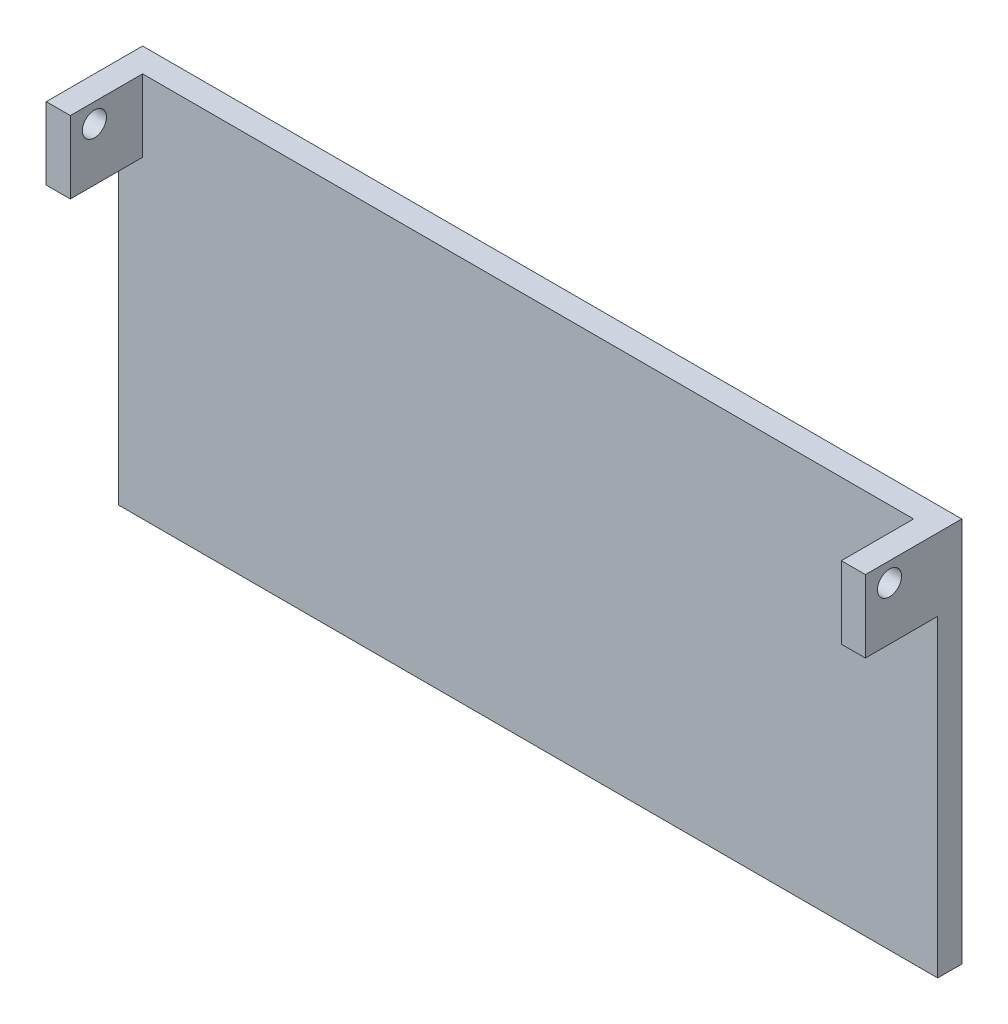
ISO-10303-21;
HEADER;
FILE_DESCRIPTION(('STEP AP214'),'2;1');
FILE_NAME('part.step','',(''),(''),'','','');
FILE_SCHEMA(('AUTOMOTIVE_DESIGN { 1 0 10303 214 1 1 1 1 }'));
ENDSEC;
DATA;
#1=APPLICATION_CONTEXT('core data for automotive mechanical design processes');
#2=APPLICATION_PROTOCOL_DEFINITION('international standard','automotive_design',2000,#1);
#3=PRODUCT_CONTEXT('',#1,'mechanical');
#4=PRODUCT('Part','Part','',(#3));
#5=PRODUCT_RELATED_PRODUCT_CATEGORY('part','',(#4));
#6=PRODUCT_DEFINITION_FORMATION('','',#4);
#7=PRODUCT_DEFINITION_CONTEXT('part definition',#1,'design');
#8=PRODUCT_DEFINITION('design','',#6,#7);
#9=PRODUCT_DEFINITION_SHAPE('','',#8);
#10=(LENGTH_UNIT() NAMED_UNIT(*) SI_UNIT(.MILLI.,.METRE.));
#11=(NAMED_UNIT(*) PLANE_ANGLE_UNIT() SI_UNIT($,.RADIAN.));
#12=(NAMED_UNIT(*) SI_UNIT($,.STERADIAN.) SOLID_ANGLE_UNIT());
#13=UNCERTAINTY_MEASURE_WITH_UNIT(LENGTH_MEASURE(1.E-05),#10,'distance_accuracy_value','');
#14=(GEOMETRIC_REPRESENTATION_CONTEXT(3) GLOBAL_UNCERTAINTY_ASSIGNED_CONTEXT((#13)) GLOBAL_UNIT_ASSIGNED_CONTEXT((#10,
#11,#12)) REPRESENTATION_CONTEXT('',''));
#15=CARTESIAN_POINT('',(0.,0.,0.));
#16=DIRECTION('',(0.,0.,1.));
#17=DIRECTION('',(1.,0.,0.));
#18=AXIS2_PLACEMENT_3D('',#15,#16,#17);
#19=CARTESIAN_POINT('',(-87.9437229437229,0.,5.));
#20=DIRECTION('',(1.,0.,0.));
#21=DIRECTION('',(0.,0.,-1.));
#22=AXIS2_PLACEMENT_3D('',#19,#20,#21);
#23=PLANE('',#22);
#24=DIRECTION('',(0.,-1.,0.));
#25=VECTOR('',#24,1.);
#26=CARTESIAN_POINT('',(-87.9437229437229,0.,5.));
#27=LINE('',#26,#25);
#28=CARTESIAN_POINT('',(-87.9437229437229,-15.,5.));
#29=VERTEX_POINT('',#28);
#30=CARTESIAN_POINT('',(-87.9437229437229,-80.,5.));
#31=VERTEX_POINT('',#30);
#32=EDGE_CURVE('E200',#29,#31,#27,.T.);
#33=ORIENTED_EDGE('',*,*,#32,.F.);
#34=DIRECTION('',(0.,0.,1.));
#35=VECTOR('',#34,1.);
#36=CARTESIAN_POINT('',(-87.9437229437229,-15.,0.));
#37=LINE('',#36,#35);
#38=CARTESIAN_POINT('',(-87.9437229437229,-15.,20.));
#39=VERTEX_POINT('',#38);
#40=EDGE_CURVE('E163',#29,#39,#37,.T.);
#41=ORIENTED_EDGE('',*,*,#40,.T.);
#42=DIRECTION('',(0.,1.,0.));
#43=VECTOR('',#42,1.);
#44=CARTESIAN_POINT('',(-87.9437229437229,0.,20.));
#45=LINE('',#44,#43);
#46=CARTESIAN_POINT('',(-87.9437229437229,0.,20.));
#47=VERTEX_POINT('',#46);
#48=EDGE_CURVE('E171',#39,#47,#45,.T.);
#49=ORIENTED_EDGE('',*,*,#48,.T.);
#50=DIRECTION('',(0.,0.,-1.));
#51=VECTOR('',#50,1.);
#52=CARTESIAN_POINT('',(-87.9437229437229,0.,5.));
#53=LINE('',#52,#51);
#54=CARTESIAN_POINT('',(-87.9437229437229,0.,0.));
#55=VERTEX_POINT('',#54);
#56=EDGE_CURVE('E212',#47,#55,#53,.T.);
#57=ORIENTED_EDGE('',*,*,#56,.T.);
#58=DIRECTION('',(0.,-1.,0.));
#59=VECTOR('',#58,1.);
#60=CARTESIAN_POINT('',(-87.9437229437229,0.,0.));
#61=LINE('',#60,#59);
#62=CARTESIAN_POINT('',(-87.9437229437229,-80.,0.));
#63=VERTEX_POINT('',#62);
#64=EDGE_CURVE('E199',#55,#63,#61,.T.);
#65=ORIENTED_EDGE('',*,*,#64,.T.);
#66=DIRECTION('',(0.,0.,-1.));
#67=VECTOR('',#66,1.);
#68=CARTESIAN_POINT('',(-87.9437229437229,-80.,5.));
#69=LINE('',#68,#67);
#70=EDGE_CURVE('E11',#31,#63,#69,.T.);
#71=ORIENTED_EDGE('',*,*,#70,.F.);
#72=EDGE_LOOP('',(#33,#41,#49,#57,#65,#71));
#73=FACE_BOUND('',#72,.T.);
#74=CARTESIAN_POINT('',(-87.9437229437229,-4.,15.));
#75=DIRECTION('',(-1.,0.,0.));
#76=DIRECTION('',(0.,0.,1.));
#77=AXIS2_PLACEMENT_3D('',#74,#75,#76);
#78=CIRCLE('',#77,2.5);
#79=CARTESIAN_POINT('',(-87.9437229437229,-4.,17.5));
#80=VERTEX_POINT('',#79);
#81=EDGE_CURVE('E158',#80,#80,#78,.T.);
#82=ORIENTED_EDGE('',*,*,#81,.F.);
#83=EDGE_LOOP('',(#82));
#84=FACE_BOUND('',#83,.T.);
#85=ADVANCED_FACE('F39',(#73,#84),#23,.F.);
#86=CARTESIAN_POINT('',(82.0562770562771,-80.,5.));
#87=DIRECTION('',(0.,1.,0.));
#88=DIRECTION('',(-1.,0.,0.));
#89=AXIS2_PLACEMENT_3D('',#86,#87,#88);
#90=PLANE('',#89);
#91=DIRECTION('',(1.,0.,0.));
#92=VECTOR('',#91,1.);
#93=CARTESIAN_POINT('',(82.0562770562771,-80.,0.));
#94=LINE('',#93,#92);
#95=CARTESIAN_POINT('',(82.0562770562771,-80.,0.));
#96=VERTEX_POINT('',#95);
#97=EDGE_CURVE('E215',#63,#96,#94,.T.);
#98=ORIENTED_EDGE('',*,*,#97,.T.);
#99=DIRECTION('',(0.,0.,-1.));
#100=VECTOR('',#99,1.);
#101=CARTESIAN_POINT('',(82.0562770562771,-80.,5.));
#102=LINE('',#101,#100);
#103=CARTESIAN_POINT('',(82.0562770562771,-80.,5.));
#104=VERTEX_POINT('',#103);
#105=EDGE_CURVE('E47',#104,#96,#102,.T.);
#106=ORIENTED_EDGE('',*,*,#105,.F.);
#107=DIRECTION('',(1.,0.,0.));
#108=VECTOR('',#107,1.);
#109=CARTESIAN_POINT('',(82.0562770562771,-80.,5.));
#110=LINE('',#109,#108);
#111=EDGE_CURVE('E203',#31,#104,#110,.T.);
#112=ORIENTED_EDGE('',*,*,#111,.F.);
#113=ORIENTED_EDGE('',*,*,#70,.T.);
#114=EDGE_LOOP('',(#98,#106,#112,#113));
#115=FACE_BOUND('',#114,.T.);
#116=ADVANCED_FACE('F272',(#115),#90,.F.);
#117=CARTESIAN_POINT('',(82.0562770562771,0.,5.));
#118=DIRECTION('',(-1.,0.,0.));
#119=DIRECTION('',(0.,-1.,0.));
#120=AXIS2_PLACEMENT_3D('',#117,#118,#119);
#121=PLANE('',#120);
#122=DIRECTION('',(0.,1.,0.));
#123=VECTOR('',#122,1.);
#124=CARTESIAN_POINT('',(82.0562770562771,0.,0.));
#125=LINE('',#124,#123);
#126=CARTESIAN_POINT('',(82.0562770562771,0.,0.));
#127=VERTEX_POINT('',#126);
#128=EDGE_CURVE('E218',#96,#127,#125,.T.);
#129=ORIENTED_EDGE('',*,*,#128,.T.);
#130=DIRECTION('',(0.,0.,-1.));
#131=VECTOR('',#130,1.);
#132=CARTESIAN_POINT('',(82.0562770562771,0.,5.));
#133=LINE('',#132,#131);
#134=CARTESIAN_POINT('',(82.0562770562771,0.,20.));
#135=VERTEX_POINT('',#134);
#136=EDGE_CURVE('E226',#135,#127,#133,.T.);
#137=ORIENTED_EDGE('',*,*,#136,.F.);
#138=DIRECTION('',(0.,-1.,0.));
#139=VECTOR('',#138,1.);
#140=CARTESIAN_POINT('',(82.0562770562771,0.,20.));
#141=LINE('',#140,#139);
#142=CARTESIAN_POINT('',(82.0562770562771,-14.9999999999999,20.));
#143=VERTEX_POINT('',#142);
#144=EDGE_CURVE('E133',#135,#143,#141,.T.);
#145=ORIENTED_EDGE('',*,*,#144,.T.);
#146=DIRECTION('',(0.,0.,-1.));
#147=VECTOR('',#146,1.);
#148=CARTESIAN_POINT('',(82.0562770562771,-14.9999999999999,20.));
#149=LINE('',#148,#147);
#150=CARTESIAN_POINT('',(82.0562770562771,-14.9999999999999,5.));
#151=VERTEX_POINT('',#150);
#152=EDGE_CURVE('E126',#143,#151,#149,.T.);
#153=ORIENTED_EDGE('',*,*,#152,.T.);
#154=DIRECTION('',(0.,1.,0.));
#155=VECTOR('',#154,1.);
#156=CARTESIAN_POINT('',(82.0562770562771,0.,5.));
#157=LINE('',#156,#155);
#158=EDGE_CURVE('E207',#104,#151,#157,.T.);
#159=ORIENTED_EDGE('',*,*,#158,.F.);
#160=ORIENTED_EDGE('',*,*,#105,.T.);
#161=EDGE_LOOP('',(#129,#137,#145,#153,#159,#160));
#162=FACE_BOUND('',#161,.T.);
#163=CARTESIAN_POINT('',(82.0562770562771,-3.99999999999994,15.));
#164=DIRECTION('',(1.,0.,0.));
#165=DIRECTION('',(0.,1.,0.));
#166=AXIS2_PLACEMENT_3D('',#163,#164,#165);
#167=CIRCLE('',#166,2.5);
#168=CARTESIAN_POINT('',(82.0562770562771,-1.49999999999994,15.));
#169=VERTEX_POINT('',#168);
#170=EDGE_CURVE('E399',#169,#169,#167,.T.);
#171=ORIENTED_EDGE('',*,*,#170,.F.);
#172=EDGE_LOOP('',(#171));
#173=FACE_BOUND('',#172,.T.);
#174=ADVANCED_FACE('F234',(#162,#173),#121,.F.);
#175=CARTESIAN_POINT('',(82.0562770562771,0.,5.));
#176=DIRECTION('',(0.,-1.,0.));
#177=DIRECTION('',(0.,0.,-1.));
#178=AXIS2_PLACEMENT_3D('',#175,#176,#177);
#179=PLANE('',#178);
#180=DIRECTION('',(-1.,0.,0.));
#181=VECTOR('',#180,1.);
#182=CARTESIAN_POINT('',(82.0562770562771,0.,0.));
#183=LINE('',#182,#181);
#184=EDGE_CURVE('E204',#127,#55,#183,.T.);
#185=ORIENTED_EDGE('',*,*,#184,.T.);
#186=ORIENTED_EDGE('',*,*,#56,.F.);
#187=DIRECTION('',(-1.,0.,0.));
#188=VECTOR('',#187,1.);
#189=CARTESIAN_POINT('',(-82.9437229437229,0.,20.));
#190=LINE('',#189,#188);
#191=CARTESIAN_POINT('',(-82.9437229437229,0.,20.));
#192=VERTEX_POINT('',#191);
#193=EDGE_CURVE('E184',#192,#47,#190,.T.);
#194=ORIENTED_EDGE('',*,*,#193,.F.);
#195=DIRECTION('',(0.,0.,-1.));
#196=VECTOR('',#195,1.);
#197=CARTESIAN_POINT('',(-82.9437229437229,0.,0.));
#198=LINE('',#197,#196);
#199=CARTESIAN_POINT('',(-82.9437229437229,0.,5.));
#200=VERTEX_POINT('',#199);
#201=EDGE_CURVE('E175',#192,#200,#198,.T.);
#202=ORIENTED_EDGE('',*,*,#201,.T.);
#203=DIRECTION('',(-1.,0.,0.));
#204=VECTOR('',#203,1.);
#205=CARTESIAN_POINT('',(82.0562770562771,0.,5.));
#206=LINE('',#205,#204);
#207=CARTESIAN_POINT('',(77.056277056277,0.,5.));
#208=VERTEX_POINT('',#207);
#209=EDGE_CURVE('E121',#208,#200,#206,.T.);
#210=ORIENTED_EDGE('',*,*,#209,.F.);
#211=DIRECTION('',(0.,0.,1.));
#212=VECTOR('',#211,1.);
#213=CARTESIAN_POINT('',(77.056277056277,0.,0.));
#214=LINE('',#213,#212);
#215=CARTESIAN_POINT('',(77.056277056277,0.,20.));
#216=VERTEX_POINT('',#215);
#217=EDGE_CURVE('E114',#208,#216,#214,.T.);
#218=ORIENTED_EDGE('',*,*,#217,.T.);
#219=DIRECTION('',(1.,0.,0.));
#220=VECTOR('',#219,1.);
#221=CARTESIAN_POINT('',(77.056277056277,0.,20.));
#222=LINE('',#221,#220);
#223=EDGE_CURVE('E118',#216,#135,#222,.T.);
#224=ORIENTED_EDGE('',*,*,#223,.T.);
#225=ORIENTED_EDGE('',*,*,#136,.T.);
#226=EDGE_LOOP('',(#185,#186,#194,#202,#210,#218,#224,#225));
#227=FACE_BOUND('',#226,.T.);
#228=ADVANCED_FACE('F116',(#227),#179,.F.);
#229=CARTESIAN_POINT('',(0.,0.,5.));
#230=DIRECTION('',(0.,0.,-1.));
#231=DIRECTION('',(-1.,0.,0.));
#232=AXIS2_PLACEMENT_3D('',#229,#230,#231);
#233=PLANE('',#232);
#234=ORIENTED_EDGE('',*,*,#158,.T.);
#235=DIRECTION('',(-1.,0.,0.));
#236=VECTOR('',#235,1.);
#237=CARTESIAN_POINT('',(0.,-15.,5.));
#238=LINE('',#237,#236);
#239=CARTESIAN_POINT('',(77.056277056277,-14.9999999999999,5.));
#240=VERTEX_POINT('',#239);
#241=EDGE_CURVE('E54',#151,#240,#238,.T.);
#242=ORIENTED_EDGE('',*,*,#241,.T.);
#243=DIRECTION('',(0.,-1.,0.));
#244=VECTOR('',#243,1.);
#245=CARTESIAN_POINT('',(77.056277056277,0.,5.));
#246=LINE('',#245,#244);
#247=EDGE_CURVE('E58',#208,#240,#246,.T.);
#248=ORIENTED_EDGE('',*,*,#247,.F.);
#249=ORIENTED_EDGE('',*,*,#209,.T.);
#250=DIRECTION('',(0.,1.,0.));
#251=VECTOR('',#250,1.);
#252=CARTESIAN_POINT('',(-82.9437229437229,0.,5.));
#253=LINE('',#252,#251);
#254=CARTESIAN_POINT('',(-82.9437229437229,-15.,5.));
#255=VERTEX_POINT('',#254);
#256=EDGE_CURVE('E188',#255,#200,#253,.T.);
#257=ORIENTED_EDGE('',*,*,#256,.F.);
#258=DIRECTION('',(-1.,0.,0.));
#259=VECTOR('',#258,1.);
#260=CARTESIAN_POINT('',(0.,-15.,5.));
#261=LINE('',#260,#259);
#262=EDGE_CURVE('E195',#255,#29,#261,.T.);
#263=ORIENTED_EDGE('',*,*,#262,.T.);
#264=ORIENTED_EDGE('',*,*,#32,.T.);
#265=ORIENTED_EDGE('',*,*,#111,.T.);
#266=EDGE_LOOP('',(#234,#242,#248,#249,#257,#263,#264,#265));
#267=FACE_BOUND('',#266,.T.);
#268=ADVANCED_FACE('F257',(#267),#233,.F.);
#269=CARTESIAN_POINT('',(0.,0.,0.));
#270=DIRECTION('',(0.,0.,-1.));
#271=DIRECTION('',(-1.,0.,0.));
#272=AXIS2_PLACEMENT_3D('',#269,#270,#271);
#273=PLANE('',#272);
#274=ORIENTED_EDGE('',*,*,#184,.F.);
#275=ORIENTED_EDGE('',*,*,#128,.F.);
#276=ORIENTED_EDGE('',*,*,#97,.F.);
#277=ORIENTED_EDGE('',*,*,#64,.F.);
#278=EDGE_LOOP('',(#274,#275,#276,#277));
#279=FACE_BOUND('',#278,.T.);
#280=ADVANCED_FACE('F241',(#279),#273,.T.);
#281=CARTESIAN_POINT('',(-82.9437229437229,-15.,0.));
#282=DIRECTION('',(0.,-1.,0.));
#283=DIRECTION('',(0.,0.,-1.));
#284=AXIS2_PLACEMENT_3D('',#281,#282,#283);
#285=PLANE('',#284);
#286=ORIENTED_EDGE('',*,*,#262,.F.);
#287=DIRECTION('',(0.,0.,1.));
#288=VECTOR('',#287,1.);
#289=CARTESIAN_POINT('',(-82.9437229437229,-15.,0.));
#290=LINE('',#289,#288);
#291=CARTESIAN_POINT('',(-82.9437229437229,-15.,20.));
#292=VERTEX_POINT('',#291);
#293=EDGE_CURVE('E167',#255,#292,#290,.T.);
#294=ORIENTED_EDGE('',*,*,#293,.T.);
#295=DIRECTION('',(-1.,0.,0.));
#296=VECTOR('',#295,1.);
#297=CARTESIAN_POINT('',(-82.9437229437229,-15.,20.));
#298=LINE('',#297,#296);
#299=EDGE_CURVE('E178',#292,#39,#298,.T.);
#300=ORIENTED_EDGE('',*,*,#299,.T.);
#301=ORIENTED_EDGE('',*,*,#40,.F.);
#302=EDGE_LOOP('',(#286,#294,#300,#301));
#303=FACE_BOUND('',#302,.T.);
#304=ADVANCED_FACE('F259',(#303),#285,.T.);
#305=CARTESIAN_POINT('',(-82.9437229437229,0.,0.));
#306=DIRECTION('',(-1.,0.,0.));
#307=DIRECTION('',(0.,0.,1.));
#308=AXIS2_PLACEMENT_3D('',#305,#306,#307);
#309=PLANE('',#308);
#310=CARTESIAN_POINT('',(-82.9437229437229,-4.,15.));
#311=DIRECTION('',(-1.,0.,0.));
#312=DIRECTION('',(0.,0.,1.));
#313=AXIS2_PLACEMENT_3D('',#310,#311,#312);
#314=CIRCLE('',#313,2.5);
#315=CARTESIAN_POINT('',(-82.9437229437229,-4.,17.5));
#316=VERTEX_POINT('',#315);
#317=EDGE_CURVE('E159',#316,#316,#314,.T.);
#318=ORIENTED_EDGE('',*,*,#317,.T.);
#319=EDGE_LOOP('',(#318));
#320=FACE_BOUND('',#319,.T.);
#321=ORIENTED_EDGE('',*,*,#293,.F.);
#322=ORIENTED_EDGE('',*,*,#256,.T.);
#323=ORIENTED_EDGE('',*,*,#201,.F.);
#324=DIRECTION('',(0.,1.,0.));
#325=VECTOR('',#324,1.);
#326=CARTESIAN_POINT('',(-82.9437229437229,0.,20.));
#327=LINE('',#326,#325);
#328=EDGE_CURVE('E170',#292,#192,#327,.T.);
#329=ORIENTED_EDGE('',*,*,#328,.F.);
#330=EDGE_LOOP('',(#321,#322,#323,#329));
#331=FACE_BOUND('',#330,.T.);
#332=ADVANCED_FACE('F255',(#320,#331),#309,.F.);
#333=CARTESIAN_POINT('',(-82.9437229437229,0.,20.));
#334=DIRECTION('',(0.,0.,1.));
#335=DIRECTION('',(1.,0.,0.));
#336=AXIS2_PLACEMENT_3D('',#333,#334,#335);
#337=PLANE('',#336);
#338=ORIENTED_EDGE('',*,*,#48,.F.);
#339=ORIENTED_EDGE('',*,*,#299,.F.);
#340=ORIENTED_EDGE('',*,*,#328,.T.);
#341=ORIENTED_EDGE('',*,*,#193,.T.);
#342=EDGE_LOOP('',(#338,#339,#340,#341));
#343=FACE_BOUND('',#342,.T.);
#344=ADVANCED_FACE('F250',(#343),#337,.T.);
#345=CARTESIAN_POINT('',(-82.9437229437229,-4.,15.));
#346=DIRECTION('',(-1.,0.,0.));
#347=DIRECTION('',(0.,0.,1.));
#348=AXIS2_PLACEMENT_3D('',#345,#346,#347);
#349=CYLINDRICAL_SURFACE('',#348,2.5);
#350=ORIENTED_EDGE('',*,*,#317,.F.);
#351=EDGE_LOOP('',(#350));
#352=FACE_BOUND('',#351,.T.);
#353=ORIENTED_EDGE('',*,*,#81,.T.);
#354=EDGE_LOOP('',(#353));
#355=FACE_BOUND('',#354,.T.);
#356=ADVANCED_FACE('F302',(#352,#355),#349,.F.);
#357=CARTESIAN_POINT('',(77.056277056277,-14.9999999999999,20.));
#358=DIRECTION('',(0.,-1.,0.));
#359=DIRECTION('',(1.,0.,0.));
#360=AXIS2_PLACEMENT_3D('',#357,#358,#359);
#361=PLANE('',#360);
#362=ORIENTED_EDGE('',*,*,#241,.F.);
#363=ORIENTED_EDGE('',*,*,#152,.F.);
#364=DIRECTION('',(1.,0.,0.));
#365=VECTOR('',#364,1.);
#366=CARTESIAN_POINT('',(77.056277056277,-14.9999999999999,20.));
#367=LINE('',#366,#365);
#368=CARTESIAN_POINT('',(77.056277056277,-14.9999999999999,20.));
#369=VERTEX_POINT('',#368);
#370=EDGE_CURVE('E135',#369,#143,#367,.T.);
#371=ORIENTED_EDGE('',*,*,#370,.F.);
#372=DIRECTION('',(0.,0.,-1.));
#373=VECTOR('',#372,1.);
#374=CARTESIAN_POINT('',(77.056277056277,-14.9999999999999,20.));
#375=LINE('',#374,#373);
#376=EDGE_CURVE('E136',#369,#240,#375,.T.);
#377=ORIENTED_EDGE('',*,*,#376,.T.);
#378=EDGE_LOOP('',(#362,#363,#371,#377));
#379=FACE_BOUND('',#378,.T.);
#380=ADVANCED_FACE('F297',(#379),#361,.T.);
#381=CARTESIAN_POINT('',(77.056277056277,0.,0.));
#382=DIRECTION('',(1.,0.,0.));
#383=DIRECTION('',(0.,0.,-1.));
#384=AXIS2_PLACEMENT_3D('',#381,#382,#383);
#385=PLANE('',#384);
#386=CARTESIAN_POINT('',(77.056277056277,-3.99999999999994,15.));
#387=DIRECTION('',(1.,0.,0.));
#388=DIRECTION('',(0.,1.,0.));
#389=AXIS2_PLACEMENT_3D('',#386,#387,#388);
#390=CIRCLE('',#389,2.5);
#391=CARTESIAN_POINT('',(77.056277056277,-1.49999999999994,15.));
#392=VERTEX_POINT('',#391);
#393=EDGE_CURVE('E148',#392,#392,#390,.T.);
#394=ORIENTED_EDGE('',*,*,#393,.T.);
#395=EDGE_LOOP('',(#394));
#396=FACE_BOUND('',#395,.T.);
#397=ORIENTED_EDGE('',*,*,#217,.F.);
#398=ORIENTED_EDGE('',*,*,#247,.T.);
#399=ORIENTED_EDGE('',*,*,#376,.F.);
#400=DIRECTION('',(0.,-1.,0.));
#401=VECTOR('',#400,1.);
#402=CARTESIAN_POINT('',(77.056277056277,0.,20.));
#403=LINE('',#402,#401);
#404=EDGE_CURVE('E125',#216,#369,#403,.T.);
#405=ORIENTED_EDGE('',*,*,#404,.F.);
#406=EDGE_LOOP('',(#397,#398,#399,#405));
#407=FACE_BOUND('',#406,.T.);
#408=ADVANCED_FACE('F138',(#396,#407),#385,.F.);
#409=CARTESIAN_POINT('',(77.056277056277,0.,20.));
#410=DIRECTION('',(0.,0.,1.));
#411=DIRECTION('',(1.,0.,0.));
#412=AXIS2_PLACEMENT_3D('',#409,#410,#411);
#413=PLANE('',#412);
#414=ORIENTED_EDGE('',*,*,#144,.F.);
#415=ORIENTED_EDGE('',*,*,#223,.F.);
#416=ORIENTED_EDGE('',*,*,#404,.T.);
#417=ORIENTED_EDGE('',*,*,#370,.T.);
#418=EDGE_LOOP('',(#414,#415,#416,#417));
#419=FACE_BOUND('',#418,.T.);
#420=ADVANCED_FACE('F130',(#419),#413,.T.);
#421=CARTESIAN_POINT('',(77.056277056277,-3.99999999999994,15.));
#422=DIRECTION('',(1.,0.,0.));
#423=DIRECTION('',(0.,1.,0.));
#424=AXIS2_PLACEMENT_3D('',#421,#422,#423);
#425=CYLINDRICAL_SURFACE('',#424,2.5);
#426=ORIENTED_EDGE('',*,*,#393,.F.);
#427=EDGE_LOOP('',(#426));
#428=FACE_BOUND('',#427,.T.);
#429=ORIENTED_EDGE('',*,*,#170,.T.);
#430=EDGE_LOOP('',(#429));
#431=FACE_BOUND('',#430,.T.);
#432=ADVANCED_FACE('F323',(#428,#431),#425,.F.);
#433=CLOSED_SHELL('',(#85,#116,#174,#228,#268,#280,#304,#332,#344,#356,#380,#408,#420,#432));
#434=MANIFOLD_SOLID_BREP('B2',#433);
#435=ADVANCED_BREP_SHAPE_REPRESENTATION('',(#18,#434),#14);
#436=SHAPE_DEFINITION_REPRESENTATION(#9,#435);
ENDSEC;
END-ISO-10303-21;
